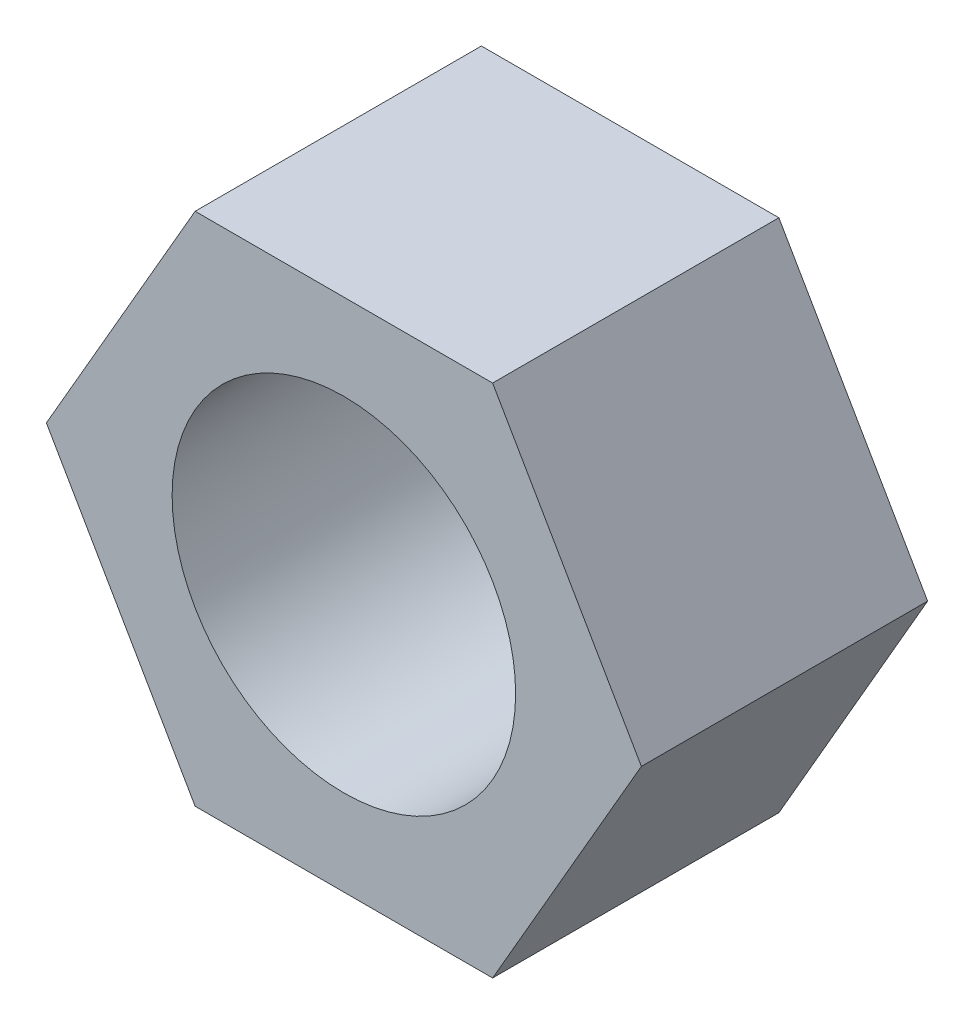
ISO-10303-21;
HEADER;
FILE_DESCRIPTION(('STEP AP214'),'2;1');
FILE_NAME('part.step','',(''),(''),'','','');
FILE_SCHEMA(('AUTOMOTIVE_DESIGN { 1 0 10303 214 1 1 1 1 }'));
ENDSEC;
DATA;
#1=APPLICATION_CONTEXT('core data for automotive mechanical design processes');
#2=APPLICATION_PROTOCOL_DEFINITION('international standard','automotive_design',2000,#1);
#3=PRODUCT_CONTEXT('',#1,'mechanical');
#4=PRODUCT('Part','Part','',(#3));
#5=PRODUCT_RELATED_PRODUCT_CATEGORY('part','',(#4));
#6=PRODUCT_DEFINITION_FORMATION('','',#4);
#7=PRODUCT_DEFINITION_CONTEXT('part definition',#1,'design');
#8=PRODUCT_DEFINITION('design','',#6,#7);
#9=PRODUCT_DEFINITION_SHAPE('','',#8);
#10=(LENGTH_UNIT() NAMED_UNIT(*) SI_UNIT(.MILLI.,.METRE.));
#11=(NAMED_UNIT(*) PLANE_ANGLE_UNIT() SI_UNIT($,.RADIAN.));
#12=(NAMED_UNIT(*) SI_UNIT($,.STERADIAN.) SOLID_ANGLE_UNIT());
#13=UNCERTAINTY_MEASURE_WITH_UNIT(LENGTH_MEASURE(1.E-05),#10,'distance_accuracy_value','');
#14=(GEOMETRIC_REPRESENTATION_CONTEXT(3) GLOBAL_UNCERTAINTY_ASSIGNED_CONTEXT((#13)) GLOBAL_UNIT_ASSIGNED_CONTEXT((#10,
#11,#12)) REPRESENTATION_CONTEXT('',''));
#15=CARTESIAN_POINT('',(0.,0.,0.));
#16=DIRECTION('',(0.,0.,1.));
#17=DIRECTION('',(1.,0.,0.));
#18=AXIS2_PLACEMENT_3D('',#15,#16,#17);
#19=CARTESIAN_POINT('',(0.,0.,25.));
#20=DIRECTION('',(0.,0.,1.));
#21=DIRECTION('',(1.,0.,0.));
#22=AXIS2_PLACEMENT_3D('',#19,#20,#21);
#23=PLANE('',#22);
#24=DIRECTION('',(0.5,0.866025403784438,0.));
#25=VECTOR('',#24,1.);
#26=CARTESIAN_POINT('',(12.9903810567666,-22.5,25.));
#27=LINE('',#26,#25);
#28=CARTESIAN_POINT('',(12.9903810567666,-22.5,25.));
#29=VERTEX_POINT('',#28);
#30=CARTESIAN_POINT('',(25.9807621135332,0.,25.));
#31=VERTEX_POINT('',#30);
#32=EDGE_CURVE('E129',#29,#31,#27,.T.);
#33=ORIENTED_EDGE('',*,*,#32,.T.);
#34=DIRECTION('',(-0.5,0.866025403784439,0.));
#35=VECTOR('',#34,1.);
#36=CARTESIAN_POINT('',(25.9807621135332,0.,25.));
#37=LINE('',#36,#35);
#38=CARTESIAN_POINT('',(12.9903810567666,22.5,25.));
#39=VERTEX_POINT('',#38);
#40=EDGE_CURVE('E87',#31,#39,#37,.T.);
#41=ORIENTED_EDGE('',*,*,#40,.T.);
#42=DIRECTION('',(-1.,0.,0.));
#43=VECTOR('',#42,1.);
#44=CARTESIAN_POINT('',(12.9903810567666,22.5,25.));
#45=LINE('',#44,#43);
#46=CARTESIAN_POINT('',(-12.9903810567666,22.5,25.));
#47=VERTEX_POINT('',#46);
#48=EDGE_CURVE('E100',#39,#47,#45,.T.);
#49=ORIENTED_EDGE('',*,*,#48,.T.);
#50=DIRECTION('',(-0.5,-0.866025403784438,0.));
#51=VECTOR('',#50,1.);
#52=CARTESIAN_POINT('',(-12.9903810567666,22.5,25.));
#53=LINE('',#52,#51);
#54=CARTESIAN_POINT('',(-25.9807621135332,0.,25.));
#55=VERTEX_POINT('',#54);
#56=EDGE_CURVE('E94',#47,#55,#53,.T.);
#57=ORIENTED_EDGE('',*,*,#56,.T.);
#58=DIRECTION('',(0.5,-0.866025403784439,0.));
#59=VECTOR('',#58,1.);
#60=CARTESIAN_POINT('',(-25.9807621135332,0.,25.));
#61=LINE('',#60,#59);
#62=CARTESIAN_POINT('',(-12.9903810567666,-22.5,25.));
#63=VERTEX_POINT('',#62);
#64=EDGE_CURVE('E98',#55,#63,#61,.T.);
#65=ORIENTED_EDGE('',*,*,#64,.T.);
#66=DIRECTION('',(1.,0.,0.));
#67=VECTOR('',#66,1.);
#68=CARTESIAN_POINT('',(-12.9903810567666,-22.5,25.));
#69=LINE('',#68,#67);
#70=EDGE_CURVE('E50',#63,#29,#69,.T.);
#71=ORIENTED_EDGE('',*,*,#70,.T.);
#72=EDGE_LOOP('',(#33,#41,#49,#57,#65,#71));
#73=FACE_BOUND('',#72,.T.);
#74=CARTESIAN_POINT('',(0.,0.,25.));
#75=DIRECTION('',(0.,0.,1.));
#76=DIRECTION('',(1.,0.,0.));
#77=AXIS2_PLACEMENT_3D('',#74,#75,#76);
#78=CIRCLE('',#77,15.);
#79=CARTESIAN_POINT('',(15.,0.,25.));
#80=VERTEX_POINT('',#79);
#81=EDGE_CURVE('E122',#80,#80,#78,.T.);
#82=ORIENTED_EDGE('',*,*,#81,.F.);
#83=EDGE_LOOP('',(#82));
#84=FACE_BOUND('',#83,.T.);
#85=ADVANCED_FACE('F33',(#73,#84),#23,.T.);
#86=CARTESIAN_POINT('',(0.,0.,0.));
#87=DIRECTION('',(0.,0.,1.));
#88=DIRECTION('',(1.,0.,0.));
#89=AXIS2_PLACEMENT_3D('',#86,#87,#88);
#90=PLANE('',#89);
#91=DIRECTION('',(0.5,0.866025403784438,0.));
#92=VECTOR('',#91,1.);
#93=CARTESIAN_POINT('',(12.9903810567666,-22.5,0.));
#94=LINE('',#93,#92);
#95=CARTESIAN_POINT('',(12.9903810567666,-22.5,0.));
#96=VERTEX_POINT('',#95);
#97=CARTESIAN_POINT('',(25.9807621135332,0.,0.));
#98=VERTEX_POINT('',#97);
#99=EDGE_CURVE('E118',#96,#98,#94,.T.);
#100=ORIENTED_EDGE('',*,*,#99,.F.);
#101=DIRECTION('',(1.,0.,0.));
#102=VECTOR('',#101,1.);
#103=CARTESIAN_POINT('',(-12.9903810567666,-22.5,0.));
#104=LINE('',#103,#102);
#105=CARTESIAN_POINT('',(-12.9903810567666,-22.5,0.));
#106=VERTEX_POINT('',#105);
#107=EDGE_CURVE('E79',#106,#96,#104,.T.);
#108=ORIENTED_EDGE('',*,*,#107,.F.);
#109=DIRECTION('',(0.5,-0.866025403784439,0.));
#110=VECTOR('',#109,1.);
#111=CARTESIAN_POINT('',(-25.9807621135332,0.,0.));
#112=LINE('',#111,#110);
#113=CARTESIAN_POINT('',(-25.9807621135332,0.,0.));
#114=VERTEX_POINT('',#113);
#115=EDGE_CURVE('E73',#114,#106,#112,.T.);
#116=ORIENTED_EDGE('',*,*,#115,.F.);
#117=DIRECTION('',(-0.5,-0.866025403784438,0.));
#118=VECTOR('',#117,1.);
#119=CARTESIAN_POINT('',(-12.9903810567666,22.5,0.));
#120=LINE('',#119,#118);
#121=CARTESIAN_POINT('',(-12.9903810567666,22.5,0.));
#122=VERTEX_POINT('',#121);
#123=EDGE_CURVE('E108',#122,#114,#120,.T.);
#124=ORIENTED_EDGE('',*,*,#123,.F.);
#125=DIRECTION('',(-1.,0.,0.));
#126=VECTOR('',#125,1.);
#127=CARTESIAN_POINT('',(12.9903810567666,22.5,0.));
#128=LINE('',#127,#126);
#129=CARTESIAN_POINT('',(12.9903810567666,22.5,0.));
#130=VERTEX_POINT('',#129);
#131=EDGE_CURVE('E124',#130,#122,#128,.T.);
#132=ORIENTED_EDGE('',*,*,#131,.F.);
#133=DIRECTION('',(-0.5,0.866025403784439,0.));
#134=VECTOR('',#133,1.);
#135=CARTESIAN_POINT('',(25.9807621135332,0.,0.));
#136=LINE('',#135,#134);
#137=EDGE_CURVE('E121',#98,#130,#136,.T.);
#138=ORIENTED_EDGE('',*,*,#137,.F.);
#139=EDGE_LOOP('',(#100,#108,#116,#124,#132,#138));
#140=FACE_BOUND('',#139,.T.);
#141=CARTESIAN_POINT('',(0.,0.,0.));
#142=DIRECTION('',(0.,0.,1.));
#143=DIRECTION('',(1.,0.,0.));
#144=AXIS2_PLACEMENT_3D('',#141,#142,#143);
#145=CIRCLE('',#144,15.);
#146=CARTESIAN_POINT('',(15.,0.,0.));
#147=VERTEX_POINT('',#146);
#148=EDGE_CURVE('E222',#147,#147,#145,.T.);
#149=ORIENTED_EDGE('',*,*,#148,.T.);
#150=EDGE_LOOP('',(#149));
#151=FACE_BOUND('',#150,.T.);
#152=ADVANCED_FACE('F138',(#140,#151),#90,.F.);
#153=CARTESIAN_POINT('',(12.9903810567666,-22.5,25.));
#154=DIRECTION('',(-0.866025403784438,0.5,0.));
#155=DIRECTION('',(-0.5,-0.866025403784439,0.));
#156=AXIS2_PLACEMENT_3D('',#153,#154,#155);
#157=PLANE('',#156);
#158=ORIENTED_EDGE('',*,*,#99,.T.);
#159=DIRECTION('',(0.,0.,-1.));
#160=VECTOR('',#159,1.);
#161=CARTESIAN_POINT('',(25.9807621135332,0.,25.));
#162=LINE('',#161,#160);
#163=EDGE_CURVE('E11',#31,#98,#162,.T.);
#164=ORIENTED_EDGE('',*,*,#163,.F.);
#165=ORIENTED_EDGE('',*,*,#32,.F.);
#166=DIRECTION('',(0.,0.,-1.));
#167=VECTOR('',#166,1.);
#168=CARTESIAN_POINT('',(12.9903810567666,-22.5,25.));
#169=LINE('',#168,#167);
#170=EDGE_CURVE('E114',#29,#96,#169,.T.);
#171=ORIENTED_EDGE('',*,*,#170,.T.);
#172=EDGE_LOOP('',(#158,#164,#165,#171));
#173=FACE_BOUND('',#172,.T.);
#174=ADVANCED_FACE('F35',(#173),#157,.F.);
#175=CARTESIAN_POINT('',(25.9807621135332,0.,25.));
#176=DIRECTION('',(-0.866025403784438,-0.5,0.));
#177=DIRECTION('',(0.5,-0.866025403784439,0.));
#178=AXIS2_PLACEMENT_3D('',#175,#176,#177);
#179=PLANE('',#178);
#180=ORIENTED_EDGE('',*,*,#137,.T.);
#181=DIRECTION('',(0.,0.,-1.));
#182=VECTOR('',#181,1.);
#183=CARTESIAN_POINT('',(12.9903810567666,22.5,25.));
#184=LINE('',#183,#182);
#185=EDGE_CURVE('E42',#39,#130,#184,.T.);
#186=ORIENTED_EDGE('',*,*,#185,.F.);
#187=ORIENTED_EDGE('',*,*,#40,.F.);
#188=ORIENTED_EDGE('',*,*,#163,.T.);
#189=EDGE_LOOP('',(#180,#186,#187,#188));
#190=FACE_BOUND('',#189,.T.);
#191=ADVANCED_FACE('F163',(#190),#179,.F.);
#192=CARTESIAN_POINT('',(12.9903810567666,22.5,25.));
#193=DIRECTION('',(0.,-1.,0.));
#194=DIRECTION('',(1.,0.,0.));
#195=AXIS2_PLACEMENT_3D('',#192,#193,#194);
#196=PLANE('',#195);
#197=ORIENTED_EDGE('',*,*,#131,.T.);
#198=DIRECTION('',(0.,0.,-1.));
#199=VECTOR('',#198,1.);
#200=CARTESIAN_POINT('',(-12.9903810567666,22.5,25.));
#201=LINE('',#200,#199);
#202=EDGE_CURVE('E109',#47,#122,#201,.T.);
#203=ORIENTED_EDGE('',*,*,#202,.F.);
#204=ORIENTED_EDGE('',*,*,#48,.F.);
#205=ORIENTED_EDGE('',*,*,#185,.T.);
#206=EDGE_LOOP('',(#197,#203,#204,#205));
#207=FACE_BOUND('',#206,.T.);
#208=ADVANCED_FACE('F135',(#207),#196,.F.);
#209=CARTESIAN_POINT('',(-12.9903810567666,22.5,25.));
#210=DIRECTION('',(0.866025403784438,-0.5,0.));
#211=DIRECTION('',(0.5,0.866025403784439,0.));
#212=AXIS2_PLACEMENT_3D('',#209,#210,#211);
#213=PLANE('',#212);
#214=ORIENTED_EDGE('',*,*,#123,.T.);
#215=DIRECTION('',(0.,0.,-1.));
#216=VECTOR('',#215,1.);
#217=CARTESIAN_POINT('',(-25.9807621135332,0.,25.));
#218=LINE('',#217,#216);
#219=EDGE_CURVE('E105',#55,#114,#218,.T.);
#220=ORIENTED_EDGE('',*,*,#219,.F.);
#221=ORIENTED_EDGE('',*,*,#56,.F.);
#222=ORIENTED_EDGE('',*,*,#202,.T.);
#223=EDGE_LOOP('',(#214,#220,#221,#222));
#224=FACE_BOUND('',#223,.T.);
#225=ADVANCED_FACE('F106',(#224),#213,.F.);
#226=CARTESIAN_POINT('',(-25.9807621135332,0.,25.));
#227=DIRECTION('',(0.866025403784439,0.5,0.));
#228=DIRECTION('',(-0.5,0.866025403784439,0.));
#229=AXIS2_PLACEMENT_3D('',#226,#227,#228);
#230=PLANE('',#229);
#231=ORIENTED_EDGE('',*,*,#115,.T.);
#232=DIRECTION('',(0.,0.,-1.));
#233=VECTOR('',#232,1.);
#234=CARTESIAN_POINT('',(-12.9903810567666,-22.5,25.));
#235=LINE('',#234,#233);
#236=EDGE_CURVE('E110',#63,#106,#235,.T.);
#237=ORIENTED_EDGE('',*,*,#236,.F.);
#238=ORIENTED_EDGE('',*,*,#64,.F.);
#239=ORIENTED_EDGE('',*,*,#219,.T.);
#240=EDGE_LOOP('',(#231,#237,#238,#239));
#241=FACE_BOUND('',#240,.T.);
#242=ADVANCED_FACE('F112',(#241),#230,.F.);
#243=CARTESIAN_POINT('',(-12.9903810567666,-22.5,25.));
#244=DIRECTION('',(0.,1.,0.));
#245=DIRECTION('',(-1.,0.,0.));
#246=AXIS2_PLACEMENT_3D('',#243,#244,#245);
#247=PLANE('',#246);
#248=ORIENTED_EDGE('',*,*,#107,.T.);
#249=ORIENTED_EDGE('',*,*,#170,.F.);
#250=ORIENTED_EDGE('',*,*,#70,.F.);
#251=ORIENTED_EDGE('',*,*,#236,.T.);
#252=EDGE_LOOP('',(#248,#249,#250,#251));
#253=FACE_BOUND('',#252,.T.);
#254=ADVANCED_FACE('F143',(#253),#247,.F.);
#255=CARTESIAN_POINT('',(0.,0.,25.));
#256=DIRECTION('',(0.,0.,-1.));
#257=DIRECTION('',(-1.,0.,0.));
#258=AXIS2_PLACEMENT_3D('',#255,#256,#257);
#259=CYLINDRICAL_SURFACE('',#258,15.);
#260=ORIENTED_EDGE('',*,*,#81,.T.);
#261=EDGE_LOOP('',(#260));
#262=FACE_BOUND('',#261,.T.);
#263=ORIENTED_EDGE('',*,*,#148,.F.);
#264=EDGE_LOOP('',(#263));
#265=FACE_BOUND('',#264,.T.);
#266=ADVANCED_FACE('F145',(#262,#265),#259,.F.);
#267=CLOSED_SHELL('',(#85,#152,#174,#191,#208,#225,#242,#254,#266));
#268=MANIFOLD_SOLID_BREP('B2',#267);
#269=ADVANCED_BREP_SHAPE_REPRESENTATION('',(#18,#268),#14);
#270=SHAPE_DEFINITION_REPRESENTATION(#9,#269);
ENDSEC;
END-ISO-10303-21;
